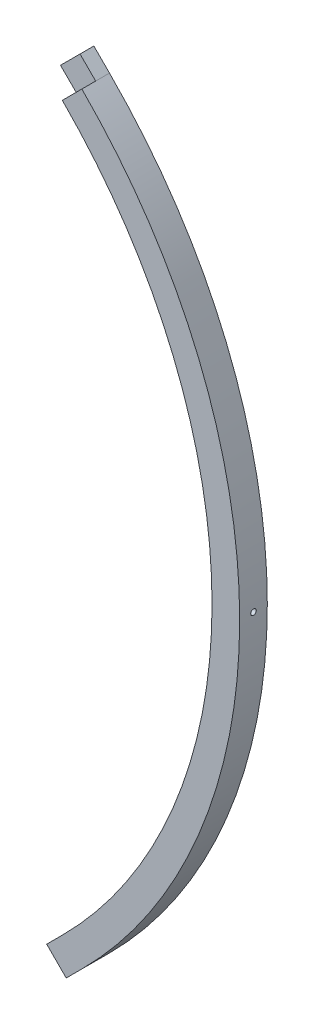
ISO-10303-21;
HEADER;
FILE_DESCRIPTION(('STEP AP214'),'2;1');
FILE_NAME('part.step','',(''),(''),'','','');
FILE_SCHEMA(('AUTOMOTIVE_DESIGN { 1 0 10303 214 1 1 1 1 }'));
ENDSEC;
DATA;
#1=APPLICATION_CONTEXT('core data for automotive mechanical design processes');
#2=APPLICATION_PROTOCOL_DEFINITION('international standard','automotive_design',2000,#1);
#3=PRODUCT_CONTEXT('',#1,'mechanical');
#4=PRODUCT('Part','Part','',(#3));
#5=PRODUCT_RELATED_PRODUCT_CATEGORY('part','',(#4));
#6=PRODUCT_DEFINITION_FORMATION('','',#4);
#7=PRODUCT_DEFINITION_CONTEXT('part definition',#1,'design');
#8=PRODUCT_DEFINITION('design','',#6,#7);
#9=PRODUCT_DEFINITION_SHAPE('','',#8);
#10=(LENGTH_UNIT() NAMED_UNIT(*) SI_UNIT(.MILLI.,.METRE.));
#11=(NAMED_UNIT(*) PLANE_ANGLE_UNIT() SI_UNIT($,.RADIAN.));
#12=(NAMED_UNIT(*) SI_UNIT($,.STERADIAN.) SOLID_ANGLE_UNIT());
#13=UNCERTAINTY_MEASURE_WITH_UNIT(LENGTH_MEASURE(1.E-05),#10,'distance_accuracy_value','');
#14=(GEOMETRIC_REPRESENTATION_CONTEXT(3) GLOBAL_UNCERTAINTY_ASSIGNED_CONTEXT((#13)) GLOBAL_UNIT_ASSIGNED_CONTEXT((#10,
#11,#12)) REPRESENTATION_CONTEXT('',''));
#15=CARTESIAN_POINT('',(0.,0.,0.));
#16=DIRECTION('',(0.,0.,1.));
#17=DIRECTION('',(1.,0.,0.));
#18=AXIS2_PLACEMENT_3D('',#15,#16,#17);
#19=CARTESIAN_POINT('',(0.,0.,139.));
#20=DIRECTION('',(-0.707106781186548,0.707106781186548,0.));
#21=DIRECTION('',(-0.707106781186548,-0.707106781186548,0.));
#22=AXIS2_PLACEMENT_3D('',#19,#20,#21);
#23=PLANE('',#22);
#24=DIRECTION('',(0.,0.,-1.));
#25=VECTOR('',#24,1.);
#26=CARTESIAN_POINT('',(137.885822331377,137.885822331377,139.));
#27=LINE('',#26,#25);
#28=CARTESIAN_POINT('',(137.885822331377,137.885822331377,10.));
#29=VERTEX_POINT('',#28);
#30=CARTESIAN_POINT('',(137.885822331377,137.885822331377,5.));
#31=VERTEX_POINT('',#30);
#32=EDGE_CURVE('E210',#29,#31,#27,.T.);
#33=ORIENTED_EDGE('',*,*,#32,.T.);
#34=DIRECTION('',(-0.707106781186548,-0.707106781186548,0.));
#35=VECTOR('',#34,1.);
#36=CARTESIAN_POINT('',(0.,0.,5.));
#37=LINE('',#36,#35);
#38=CARTESIAN_POINT('',(130.814754519511,130.814754519511,5.));
#39=VERTEX_POINT('',#38);
#40=EDGE_CURVE('E135',#31,#39,#37,.T.);
#41=ORIENTED_EDGE('',*,*,#40,.T.);
#42=DIRECTION('',(0.,0.,-1.));
#43=VECTOR('',#42,1.);
#44=CARTESIAN_POINT('',(130.814754519511,130.814754519511,139.));
#45=LINE('',#44,#43);
#46=CARTESIAN_POINT('',(130.814754519511,130.814754519511,10.));
#47=VERTEX_POINT('',#46);
#48=EDGE_CURVE('E221',#47,#39,#45,.T.);
#49=ORIENTED_EDGE('',*,*,#48,.F.);
#50=DIRECTION('',(-0.707106781186548,-0.707106781186548,0.));
#51=VECTOR('',#50,1.);
#52=CARTESIAN_POINT('',(0.,0.,10.));
#53=LINE('',#52,#51);
#54=EDGE_CURVE('E214',#29,#47,#53,.T.);
#55=ORIENTED_EDGE('',*,*,#54,.F.);
#56=EDGE_LOOP('',(#33,#41,#49,#55));
#57=FACE_BOUND('',#56,.T.);
#58=ADVANCED_FACE('F41',(#57),#23,.T.);
#59=CARTESIAN_POINT('',(0.,0.,139.));
#60=DIRECTION('',(0.707106781186548,0.707106781186548,0.));
#61=DIRECTION('',(-0.707106781186548,0.707106781186548,0.));
#62=AXIS2_PLACEMENT_3D('',#59,#60,#61);
#63=PLANE('',#62);
#64=DIRECTION('',(0.707106781186548,-0.707106781186548,0.));
#65=VECTOR('',#64,1.);
#66=CARTESIAN_POINT('',(0.,0.,5.));
#67=LINE('',#66,#65);
#68=CARTESIAN_POINT('',(130.814754519511,-130.814754519511,5.));
#69=VERTEX_POINT('',#68);
#70=CARTESIAN_POINT('',(137.885822331377,-137.885822331377,5.));
#71=VERTEX_POINT('',#70);
#72=EDGE_CURVE('E73',#69,#71,#67,.T.);
#73=ORIENTED_EDGE('',*,*,#72,.F.);
#74=DIRECTION('',(0.,0.,-1.));
#75=VECTOR('',#74,1.);
#76=CARTESIAN_POINT('',(130.814754519511,-130.814754519511,139.));
#77=LINE('',#76,#75);
#78=CARTESIAN_POINT('',(130.814754519511,-130.814754519511,0.));
#79=VERTEX_POINT('',#78);
#80=EDGE_CURVE('E220',#69,#79,#77,.T.);
#81=ORIENTED_EDGE('',*,*,#80,.T.);
#82=DIRECTION('',(0.707106781186548,-0.707106781186548,0.));
#83=VECTOR('',#82,1.);
#84=CARTESIAN_POINT('',(0.,0.,0.));
#85=LINE('',#84,#83);
#86=CARTESIAN_POINT('',(137.885822331377,-137.885822331377,0.));
#87=VERTEX_POINT('',#86);
#88=EDGE_CURVE('E206',#79,#87,#85,.T.);
#89=ORIENTED_EDGE('',*,*,#88,.T.);
#90=DIRECTION('',(0.,0.,-1.));
#91=VECTOR('',#90,1.);
#92=CARTESIAN_POINT('',(137.885822331377,-137.885822331377,139.));
#93=LINE('',#92,#91);
#94=EDGE_CURVE('E215',#71,#87,#93,.T.);
#95=ORIENTED_EDGE('',*,*,#94,.F.);
#96=EDGE_LOOP('',(#73,#81,#89,#95));
#97=FACE_BOUND('',#96,.T.);
#98=ADVANCED_FACE('F264',(#97),#63,.F.);
#99=CARTESIAN_POINT('',(0.,0.,10.));
#100=DIRECTION('',(0.,0.,-1.));
#101=DIRECTION('',(-1.,0.,0.));
#102=AXIS2_PLACEMENT_3D('',#99,#100,#101);
#103=CYLINDRICAL_SURFACE('',#102,195.);
#104=CARTESIAN_POINT('',(0.,0.,10.));
#105=DIRECTION('',(0.,0.,1.));
#106=DIRECTION('',(1.,0.,0.));
#107=AXIS2_PLACEMENT_3D('',#104,#105,#106);
#108=CIRCLE('',#107,195.);
#109=CARTESIAN_POINT('',(137.885822331377,-137.885822331377,10.));
#110=VERTEX_POINT('',#109);
#111=EDGE_CURVE('E11',#110,#29,#108,.T.);
#112=ORIENTED_EDGE('',*,*,#111,.F.);
#113=EDGE_CURVE('E211',#110,#71,#93,.T.);
#114=ORIENTED_EDGE('',*,*,#113,.T.);
#115=ORIENTED_EDGE('',*,*,#94,.T.);
#116=CARTESIAN_POINT('',(0.,0.,0.));
#117=DIRECTION('',(0.,0.,1.));
#118=DIRECTION('',(1.,0.,0.));
#119=AXIS2_PLACEMENT_3D('',#116,#117,#118);
#120=CIRCLE('',#119,195.);
#121=CARTESIAN_POINT('',(137.885822331377,137.885822331377,0.));
#122=VERTEX_POINT('',#121);
#123=EDGE_CURVE('E57',#87,#122,#120,.T.);
#124=ORIENTED_EDGE('',*,*,#123,.T.);
#125=DIRECTION('',(0.,0.,-1.));
#126=VECTOR('',#125,1.);
#127=CARTESIAN_POINT('',(137.885822331377,137.885822331377,0.));
#128=LINE('',#127,#126);
#129=EDGE_CURVE('E156',#31,#122,#128,.T.);
#130=ORIENTED_EDGE('',*,*,#129,.F.);
#131=ORIENTED_EDGE('',*,*,#32,.F.);
#132=EDGE_LOOP('',(#112,#114,#115,#124,#130,#131));
#133=FACE_BOUND('',#132,.T.);
#134=CARTESIAN_POINT('',(195.,0.,6.));
#135=CARTESIAN_POINT('',(194.999999965327,-0.0561700427574793,5.99999750928889));
#136=CARTESIAN_POINT('',(194.999975469612,-0.112380804679505,5.99525150927542));
#137=CARTESIAN_POINT('',(194.999880106191,-0.223254227617488,5.97638464830237));
#138=CARTESIAN_POINT('',(194.999809182684,-0.277914943033491,5.9622525057641));
#139=CARTESIAN_POINT('',(194.999628998058,-0.38406595254384,5.92501570410519));
#140=CARTESIAN_POINT('',(194.999519755267,-0.43555774842897,5.90191533367156));
#141=CARTESIAN_POINT('',(194.99927526481,-0.533917824580093,5.84740370906358));
#142=CARTESIAN_POINT('',(194.999140023609,-0.580787249943005,5.8159945203631));
#143=CARTESIAN_POINT('',(194.998858748926,-0.668593964518465,5.74575020299985));
#144=CARTESIAN_POINT('',(194.998712714227,-0.709530583657943,5.70691423667652));
#145=CARTESIAN_POINT('',(194.998426323083,-0.784304319411508,5.6229193177131));
#146=CARTESIAN_POINT('',(194.998285966862,-0.818141157104063,5.57776011677499));
#147=CARTESIAN_POINT('',(194.998026765331,-0.877752499155994,5.48240246823632));
#148=CARTESIAN_POINT('',(194.99790791974,-0.903527109287217,5.43220408675835));
#149=CARTESIAN_POINT('',(194.997705136625,-0.946282825200783,5.32819265591582));
#150=CARTESIAN_POINT('',(194.997621199029,-0.963263949178651,5.27437961403098));
#151=CARTESIAN_POINT('',(194.997497695716,-0.987950614499664,5.1646667690424));
#152=CARTESIAN_POINT('',(194.997458129688,-0.995656220884792,5.10876698057421));
#153=CARTESIAN_POINT('',(194.997427829408,-1.00157329952117,4.99646724778798));
#154=CARTESIAN_POINT('',(194.997437095065,-0.999784789487698,4.94006730440338));
#155=CARTESIAN_POINT('',(194.997503412978,-0.986764512178178,4.82836872592286));
#156=CARTESIAN_POINT('',(194.997560464802,-0.975532830252614,4.77307008087767));
#157=CARTESIAN_POINT('',(194.997715922301,-0.943945159213853,4.66514326214855));
#158=CARTESIAN_POINT('',(194.997814328021,-0.923589160162509,4.61251509137336));
#159=CARTESIAN_POINT('',(194.998041399341,-0.87433060514092,4.51142297158604));
#160=CARTESIAN_POINT('',(194.998170065076,-0.845428011055289,4.46295904114649));
#161=CARTESIAN_POINT('',(194.998443150182,-0.77989676630526,4.37157136761662));
#162=CARTESIAN_POINT('',(194.998587569548,-0.74326811816065,4.32864762271941));
#163=CARTESIAN_POINT('',(194.998875881859,-0.66332402880329,4.24955825290822));
#164=CARTESIAN_POINT('',(194.999019774797,-0.620008509698191,4.21339270672829));
#165=CARTESIAN_POINT('',(194.999290809853,-0.527920547393154,4.14884696896129));
#166=CARTESIAN_POINT('',(194.99941795197,-0.479148103475928,4.12046677839759));
#167=CARTESIAN_POINT('',(194.999641151155,-0.3775307614997,4.07229739794683));
#168=CARTESIAN_POINT('',(194.999737208217,-0.324685862518095,4.05250821000606));
#169=CARTESIAN_POINT('',(194.999887407497,-0.216423740359311,4.02208263927458));
#170=CARTESIAN_POINT('',(194.999941549721,-0.16100651749917,4.01144625535579));
#171=CARTESIAN_POINT('',(195.000001814811,-0.0491735529694545,3.99962832171398));
#172=CARTESIAN_POINT('',(195.000007938224,0.00724217731589919,3.99844666426487));
#173=CARTESIAN_POINT('',(194.999971476776,0.119471277683585,4.00557144695906));
#174=CARTESIAN_POINT('',(194.999928891913,0.175284647759942,4.01387788719649));
#175=CARTESIAN_POINT('',(194.999799815327,0.284724351598063,4.03974298208161));
#176=CARTESIAN_POINT('',(194.999713323834,0.338350696794177,4.05730158834984));
#177=CARTESIAN_POINT('',(194.999506185112,0.441894401754199,4.10117252636068));
#178=CARTESIAN_POINT('',(194.999385537886,0.491811761769895,4.12748485750903));
#179=CARTESIAN_POINT('',(194.999123688085,0.586520988262377,4.18811659101685));
#180=CARTESIAN_POINT('',(194.998982485327,0.631312808902113,4.22243606497484));
#181=CARTESIAN_POINT('',(194.998695444373,0.714499007167161,4.29810776611433));
#182=CARTESIAN_POINT('',(194.998549606175,0.752893381802226,4.33945999658302));
#183=CARTESIAN_POINT('',(194.998269734921,0.822195132823353,4.42802380835305));
#184=CARTESIAN_POINT('',(194.998135701978,0.85310243745302,4.47523544580463));
#185=CARTESIAN_POINT('',(194.997894554343,0.906552163269164,4.57417753232033));
#186=CARTESIAN_POINT('',(194.997787439622,0.929094593579837,4.62590797645536));
#187=CARTESIAN_POINT('',(194.997612205448,0.965174574853683,4.73241896230374));
#188=CARTESIAN_POINT('',(194.997544085786,0.97871217433128,4.78719948758275));
#189=CARTESIAN_POINT('',(194.997454521003,0.996398378516396,4.89825591457816));
#190=CARTESIAN_POINT('',(194.997433075963,1.0005469670395,4.95453181887206));
#191=CARTESIAN_POINT('',(194.997439278513,0.999337333540501,5.06698060298473));
#192=CARTESIAN_POINT('',(194.997466925448,0.993979238581673,5.12315348417042));
#193=CARTESIAN_POINT('',(194.997568193698,0.973908568331291,5.23380250667898));
#194=CARTESIAN_POINT('',(194.997641815105,0.959195974235457,5.28827864459086));
#195=CARTESIAN_POINT('',(194.99782673377,0.920833638030294,5.39398864687603));
#196=CARTESIAN_POINT('',(194.997938031729,0.897183729665312,5.44522245091337));
#197=CARTESIAN_POINT('',(194.998185749824,0.841619125480419,5.54299039607154));
#198=CARTESIAN_POINT('',(194.998322168976,0.809704753430099,5.58952472120047));
#199=CARTESIAN_POINT('',(194.998604739991,0.738520541059488,5.67657102458573));
#200=CARTESIAN_POINT('',(194.998750890947,0.699251386211935,5.71708356344764));
#201=CARTESIAN_POINT('',(194.999036498686,0.614457557526826,5.79095118783567));
#202=CARTESIAN_POINT('',(194.999175953796,0.568931331481623,5.82430449207619));
#203=CARTESIAN_POINT('',(194.99943246922,0.472907480285743,5.88290723832369));
#204=CARTESIAN_POINT('',(194.999549518697,0.422407467208872,5.90815276274138));
#205=CARTESIAN_POINT('',(194.999747797733,0.317925375579559,5.94977815488281));
#206=CARTESIAN_POINT('',(194.999829070206,0.263947558144781,5.96616864927851));
#207=CARTESIAN_POINT('',(194.999924794305,0.174688187979034,5.98525101010267));
#208=CARTESIAN_POINT('',(194.999952874926,0.139986605025111,5.99077497702719));
#209=CARTESIAN_POINT('',(194.999990488608,0.0701953164853874,5.99815025029287));
#210=CARTESIAN_POINT('',(195.00000002167,0.0351056109028527,6.00000155666492));
#211=CARTESIAN_POINT('',(195.,0.,6.));
#212=B_SPLINE_CURVE_WITH_KNOTS('',3,(#134,#135,#136,#137,#138,#139,#140,#141,#142,#143,#144,
#145,#146,#147,#148,#149,#150,#151,#152,#153,#154,#155,#156,#157,#158,#159,#160,#161,#162,#163,
#164,#165,#166,#167,#168,#169,#170,#171,#172,#173,#174,#175,#176,#177,#178,#179,#180,#181,#182,
#183,#184,#185,#186,#187,#188,#189,#190,#191,#192,#193,#194,#195,#196,#197,#198,#199,#200,#201,
#202,#203,#204,#205,#206,#207,#208,#209,#210,#211),.UNSPECIFIED.,.T.,.F.,(4,2,2,2,2,2,2,2,2,2,2,
2,2,2,2,2,2,2,2,2,2,2,2,2,2,2,2,2,2,2,2,2,2,2,2,2,2,2,4),(0.,0.168381992750483,
0.336966737668812,0.50547096295735,0.673933339389159,0.842414727781486,1.01090273388347,
1.1793885294258,1.34787397633513,1.51635824178032,1.68484219284708,1.85332462111697,
2.0218072328973,2.19029059607355,2.35877390430046,2.52725917526168,2.69574446836956,
2.86422979964747,3.03271511015966,3.2011985009664,3.36968189344445,3.53816440493341,
3.70664690498479,3.87513091163614,4.04361499703882,4.21210069713623,4.38058621345311,
4.54907082203011,4.71755572103408,4.88603836813989,5.05452135392815,5.22300747406155,
5.39148699456141,5.55995082041694,5.72845651321086,5.89704350401415,6.0654277263599,
6.17066447677132,6.27590122629753),.UNSPECIFIED.);
#213=CARTESIAN_POINT('',(195.,0.,6.));
#214=VERTEX_POINT('',#213);
#215=EDGE_CURVE('E231',#214,#214,#212,.T.);
#216=ORIENTED_EDGE('',*,*,#215,.F.);
#217=EDGE_LOOP('',(#216));
#218=FACE_BOUND('',#217,.T.);
#219=ADVANCED_FACE('F43',(#133,#218),#103,.T.);
#220=CARTESIAN_POINT('',(0.,0.,10.));
#221=DIRECTION('',(0.,0.,-1.));
#222=DIRECTION('',(-1.,0.,0.));
#223=AXIS2_PLACEMENT_3D('',#220,#221,#222);
#224=CYLINDRICAL_SURFACE('',#223,185.);
#225=CARTESIAN_POINT('',(130.814754519511,-130.814754519511,10.));
#226=VERTEX_POINT('',#225);
#227=EDGE_CURVE('E216',#226,#69,#77,.T.);
#228=ORIENTED_EDGE('',*,*,#227,.F.);
#229=CARTESIAN_POINT('',(0.,0.,10.));
#230=DIRECTION('',(0.,0.,1.));
#231=DIRECTION('',(1.,0.,0.));
#232=AXIS2_PLACEMENT_3D('',#229,#230,#231);
#233=CIRCLE('',#232,185.);
#234=EDGE_CURVE('E239',#226,#47,#233,.T.);
#235=ORIENTED_EDGE('',*,*,#234,.T.);
#236=ORIENTED_EDGE('',*,*,#48,.T.);
#237=DIRECTION('',(0.,0.,1.));
#238=VECTOR('',#237,1.);
#239=CARTESIAN_POINT('',(130.814754519511,130.814754519511,0.));
#240=LINE('',#239,#238);
#241=CARTESIAN_POINT('',(130.814754519511,130.814754519511,0.));
#242=VERTEX_POINT('',#241);
#243=EDGE_CURVE('E65',#242,#39,#240,.T.);
#244=ORIENTED_EDGE('',*,*,#243,.F.);
#245=CARTESIAN_POINT('',(0.,0.,0.));
#246=DIRECTION('',(0.,0.,1.));
#247=DIRECTION('',(1.,0.,0.));
#248=AXIS2_PLACEMENT_3D('',#245,#246,#247);
#249=CIRCLE('',#248,185.);
#250=EDGE_CURVE('E238',#79,#242,#249,.T.);
#251=ORIENTED_EDGE('',*,*,#250,.F.);
#252=ORIENTED_EDGE('',*,*,#80,.F.);
#253=EDGE_LOOP('',(#228,#235,#236,#244,#251,#252));
#254=FACE_BOUND('',#253,.T.);
#255=CARTESIAN_POINT('',(185.,0.,6.));
#256=CARTESIAN_POINT('',(184.999999963453,-0.056169998764352,5.99999750930369));
#257=CARTESIAN_POINT('',(184.999974143686,-0.11238071561792,5.99525151669553));
#258=CARTESIAN_POINT('',(184.999873625645,-0.223254046643,5.97638468685081));
#259=CARTESIAN_POINT('',(184.999798868555,-0.27791471526249,5.96225256833333));
#260=CARTESIAN_POINT('',(184.999608944514,-0.384065630941757,5.9250158342348));
#261=CARTESIAN_POINT('',(184.999493796884,-0.43555737990926,5.90191550766809));
#262=CARTESIAN_POINT('',(184.999236091078,-0.533917371535847,5.84740399037893));
#263=CARTESIAN_POINT('',(184.999093539716,-0.580786759221734,5.81599486500276));
#264=CARTESIAN_POINT('',(184.998797061135,-0.668593455494542,5.74575065814661));
#265=CARTESIAN_POINT('',(184.998643132623,-0.70953008859501,5.70691473223819));
#266=CARTESIAN_POINT('',(184.99834126067,-0.784303862364997,5.62291989167873));
#267=CARTESIAN_POINT('',(184.998193317465,-0.818140724100741,5.57776072871835));
#268=CARTESIAN_POINT('',(184.997920104531,-0.877752143298278,5.48240311819685));
#269=CARTESIAN_POINT('',(184.997794834518,-0.903526801603803,5.43220473367775));
#270=CARTESIAN_POINT('',(184.997581089484,-0.946282610189101,5.32819328055058));
#271=CARTESIAN_POINT('',(184.997492614386,-0.963263778721366,5.27438021944571));
#272=CARTESIAN_POINT('',(184.997362434697,-0.987950511956365,5.16466737689804));
#273=CARTESIAN_POINT('',(184.997320729731,-0.99565615088585,5.10876761215763));
#274=CARTESIAN_POINT('',(184.997288791168,-1.00157330083936,4.99646791968125));
#275=CARTESIAN_POINT('',(184.997298557474,-0.999784829646088,4.94006799288229));
#276=CARTESIAN_POINT('',(184.99736845976,-0.98676464274239,4.8283695020497));
#277=CARTESIAN_POINT('',(184.997428595231,-0.975533022250442,4.77307092691653));
#278=CARTESIAN_POINT('',(184.997592455331,-0.943945500344341,4.66514423767283));
#279=CARTESIAN_POINT('',(184.997696180006,-0.923589588958082,4.61251612648097));
#280=CARTESIAN_POINT('',(184.997935524963,-0.874331221624814,4.5114240816823));
#281=CARTESIAN_POINT('',(184.998071145403,-0.845428723022011,4.46296016886045));
#282=CARTESIAN_POINT('',(184.998358991537,-0.779897682158746,4.37157251000944));
#283=CARTESIAN_POINT('',(184.998511217225,-0.743269142350609,4.32864876222178));
#284=CARTESIAN_POINT('',(184.998815114046,-0.663325223648003,4.24955930871775));
#285=CARTESIAN_POINT('',(184.998966785172,-0.620009758314378,4.21339369037431));
#286=CARTESIAN_POINT('',(184.999252471274,-0.527921886126884,4.14884779882796));
#287=CARTESIAN_POINT('',(184.999386486248,-0.479149478555264,4.12046752664906));
#288=CARTESIAN_POINT('',(184.999621750971,-0.37753218600141,4.07229797677546));
#289=CARTESIAN_POINT('',(184.999723000713,-0.324687299974519,4.05250870128451));
#290=CARTESIAN_POINT('',(184.999881319727,-0.216425182084915,4.02208295715273));
#291=CARTESIAN_POINT('',(184.999938389003,-0.161007950561575,4.01144648730437));
#292=CARTESIAN_POINT('',(185.000001912502,-0.04917502232657,3.99962839648125));
#293=CARTESIAN_POINT('',(185.000008367365,0.00724066173670763,3.99844665581987));
#294=CARTESIAN_POINT('',(184.999969935997,0.119469683422408,4.00557125798055));
#295=CARTESIAN_POINT('',(184.999925049766,0.175283021041205,4.01387760085972));
#296=CARTESIAN_POINT('',(184.999788997138,0.28472264152107,4.03974247980008));
#297=CARTESIAN_POINT('',(184.999697831011,0.338348937096478,4.05730096206582));
#298=CARTESIAN_POINT('',(184.999479496722,0.441892565162782,4.10117162891953));
#299=CARTESIAN_POINT('',(184.999352328562,0.491809897879607,4.12748381297429));
#300=CARTESIAN_POINT('',(184.999076325492,0.586519148135399,4.1881152642877));
#301=CARTESIAN_POINT('',(184.998927490366,0.631311014670736,4.22243461121548));
#302=CARTESIAN_POINT('',(184.998624933839,0.71449732997275,4.29810606204115));
#303=CARTESIAN_POINT('',(184.998471212435,0.7528917757047,4.33945816927512));
#304=CARTESIAN_POINT('',(184.998176212434,0.822193732053476,4.42802179305794));
#305=CARTESIAN_POINT('',(184.998034933968,0.853101163217055,4.47523337178028));
#306=CARTESIAN_POINT('',(184.997780750132,0.906551149209531,4.57417537043761));
#307=CARTESIAN_POINT('',(184.997667844731,0.929093713195242,4.62590578542588));
#308=CARTESIAN_POINT('',(184.997483137028,0.965173951500727,4.73241671419921));
#309=CARTESIAN_POINT('',(184.997411334481,0.978711679347289,4.78719720985182));
#310=CARTESIAN_POINT('',(184.997316926876,0.996398142723863,4.89825360360009));
#311=CARTESIAN_POINT('',(184.997294321902,1.000546862151,4.95452950426033));
#312=CARTESIAN_POINT('',(184.997300858329,0.999337488837895,5.06697823086784));
#313=CARTESIAN_POINT('',(184.997329998972,0.993979535256863,5.12315105831186));
#314=CARTESIAN_POINT('',(184.997436739774,0.973909167054334,5.23379999619835));
#315=CARTESIAN_POINT('',(184.99751434003,0.959196733629315,5.28827610323001));
#316=CARTESIAN_POINT('',(184.997709253022,0.920834736157888,5.3939860697002));
#317=CARTESIAN_POINT('',(184.997826566496,0.897185005879216,5.44521986881164));
#318=CARTESIAN_POINT('',(184.99808767375,0.841620771098656,5.5429878370667));
#319=CARTESIAN_POINT('',(184.998231466491,0.809706590282481,5.58952219016976));
#320=CARTESIAN_POINT('',(184.998529311227,0.7385227199247,5.67656864504324));
#321=CARTESIAN_POINT('',(184.998683362277,0.699253706479979,5.71708129974799));
#322=CARTESIAN_POINT('',(184.998984408656,0.614460139381037,5.79094918108799));
#323=CARTESIAN_POINT('',(184.999131402222,0.568934033533058,5.82430262646598));
#324=CARTESIAN_POINT('',(184.999401784391,0.472910366219206,5.88290569381243));
#325=CARTESIAN_POINT('',(184.999525161558,0.422410414089445,5.90815139373502));
#326=CARTESIAN_POINT('',(184.999734159945,0.317928404912174,5.94977714252628));
#327=CARTESIAN_POINT('',(184.999819826397,0.263950608955148,5.96616781787776));
#328=CARTESIAN_POINT('',(184.999920726796,0.174690756440777,5.98525057321122));
#329=CARTESIAN_POINT('',(184.999950326157,0.139988670838887,5.99077470358214));
#330=CARTESIAN_POINT('',(184.99998997418,0.070196358621374,5.99815019529936));
#331=CARTESIAN_POINT('',(185.000000022842,0.0351061320093793,6.00000155667999));
#332=CARTESIAN_POINT('',(185.,0.,6.));
#333=B_SPLINE_CURVE_WITH_KNOTS('',3,(#255,#256,#257,#258,#259,#260,#261,#262,#263,#264,#265,
#266,#267,#268,#269,#270,#271,#272,#273,#274,#275,#276,#277,#278,#279,#280,#281,#282,#283,#284,
#285,#286,#287,#288,#289,#290,#291,#292,#293,#294,#295,#296,#297,#298,#299,#300,#301,#302,#303,
#304,#305,#306,#307,#308,#309,#310,#311,#312,#313,#314,#315,#316,#317,#318,#319,#320,#321,#322,
#323,#324,#325,#326,#327,#328,#329,#330,#331,#332),.UNSPECIFIED.,.T.,.F.,(4,2,2,2,2,2,2,2,2,2,2,
2,2,2,2,2,2,2,2,2,2,2,2,2,2,2,2,2,2,2,2,2,2,2,2,2,2,2,4),(0.,0.168381858854091,
0.336966464713395,0.505470544693635,0.673932778338218,0.842414177566964,1.01090219480558,
1.17938810447643,1.34787366442261,1.51635787606639,1.68484177213534,1.85332396934446,
2.02180635069133,2.19028957294356,2.35877274171754,2.52725808858703,2.69574345761747,
2.86422886986733,3.03271425988863,3.201197517064,3.36968077525344,3.53816305382806,
3.70664532213973,3.87512926687651,4.04361329153635,4.21209910409392,4.38058473221368,
4.54906935880771,4.71755427436564,4.88603672365226,5.05451951160803,5.22300543347044,
5.39148475740607,5.55994860138531,5.72845431178956,5.89704141289923,6.06542574890547,
6.17066406028525,6.27590237068144),.UNSPECIFIED.);
#334=CARTESIAN_POINT('',(185.,0.,6.));
#335=VERTEX_POINT('',#334);
#336=EDGE_CURVE('E46',#335,#335,#333,.T.);
#337=ORIENTED_EDGE('',*,*,#336,.T.);
#338=EDGE_LOOP('',(#337));
#339=FACE_BOUND('',#338,.T.);
#340=ADVANCED_FACE('F249',(#254,#339),#224,.F.);
#341=CARTESIAN_POINT('',(0.,0.,10.));
#342=DIRECTION('',(0.,0.,1.));
#343=DIRECTION('',(1.,0.,0.));
#344=AXIS2_PLACEMENT_3D('',#341,#342,#343);
#345=PLANE('',#344);
#346=ORIENTED_EDGE('',*,*,#234,.F.);
#347=DIRECTION('',(0.707106781186548,0.707106781186547,0.));
#348=VECTOR('',#347,1.);
#349=CARTESIAN_POINT('',(125.157900270019,-136.471608769004,10.));
#350=LINE('',#349,#348);
#351=CARTESIAN_POINT('',(125.157900270019,-136.471608769004,10.));
#352=VERTEX_POINT('',#351);
#353=EDGE_CURVE('E188',#352,#226,#350,.T.);
#354=ORIENTED_EDGE('',*,*,#353,.F.);
#355=DIRECTION('',(-0.707106781186548,0.707106781186548,0.));
#356=VECTOR('',#355,1.);
#357=CARTESIAN_POINT('',(-5.65685424949239,-5.65685424949239,10.));
#358=LINE('',#357,#356);
#359=CARTESIAN_POINT('',(132.228968081884,-143.542676580869,10.));
#360=VERTEX_POINT('',#359);
#361=EDGE_CURVE('E185',#360,#352,#358,.T.);
#362=ORIENTED_EDGE('',*,*,#361,.F.);
#363=DIRECTION('',(0.707106781186548,0.707106781186547,0.));
#364=VECTOR('',#363,1.);
#365=CARTESIAN_POINT('',(132.228968081884,-143.542676580869,10.));
#366=LINE('',#365,#364);
#367=EDGE_CURVE('E194',#360,#110,#366,.T.);
#368=ORIENTED_EDGE('',*,*,#367,.T.);
#369=ORIENTED_EDGE('',*,*,#111,.T.);
#370=ORIENTED_EDGE('',*,*,#54,.T.);
#371=EDGE_LOOP('',(#346,#354,#362,#368,#369,#370));
#372=FACE_BOUND('',#371,.T.);
#373=ADVANCED_FACE('F254',(#372),#345,.T.);
#374=CARTESIAN_POINT('',(0.,0.,0.));
#375=DIRECTION('',(0.,0.,1.));
#376=DIRECTION('',(1.,0.,0.));
#377=AXIS2_PLACEMENT_3D('',#374,#375,#376);
#378=PLANE('',#377);
#379=ORIENTED_EDGE('',*,*,#123,.F.);
#380=ORIENTED_EDGE('',*,*,#88,.F.);
#381=ORIENTED_EDGE('',*,*,#250,.T.);
#382=DIRECTION('',(0.707106781186548,-0.707106781186547,0.));
#383=VECTOR('',#382,1.);
#384=CARTESIAN_POINT('',(125.157900270019,136.471608769004,0.));
#385=LINE('',#384,#383);
#386=CARTESIAN_POINT('',(125.157900270019,136.471608769004,0.));
#387=VERTEX_POINT('',#386);
#388=EDGE_CURVE('E170',#387,#242,#385,.T.);
#389=ORIENTED_EDGE('',*,*,#388,.F.);
#390=DIRECTION('',(-0.707106781186548,-0.707106781186548,0.));
#391=VECTOR('',#390,1.);
#392=CARTESIAN_POINT('',(-5.65685424949239,5.65685424949239,0.));
#393=LINE('',#392,#391);
#394=CARTESIAN_POINT('',(132.228968081884,143.542676580869,0.));
#395=VERTEX_POINT('',#394);
#396=EDGE_CURVE('E148',#395,#387,#393,.T.);
#397=ORIENTED_EDGE('',*,*,#396,.F.);
#398=DIRECTION('',(0.707106781186548,-0.707106781186547,0.));
#399=VECTOR('',#398,1.);
#400=CARTESIAN_POINT('',(132.228968081884,143.542676580869,0.));
#401=LINE('',#400,#399);
#402=EDGE_CURVE('E139',#395,#122,#401,.T.);
#403=ORIENTED_EDGE('',*,*,#402,.T.);
#404=EDGE_LOOP('',(#379,#380,#381,#389,#397,#403));
#405=FACE_BOUND('',#404,.T.);
#406=ADVANCED_FACE('F246',(#405),#378,.F.);
#407=CARTESIAN_POINT('',(250.,0.,5.));
#408=DIRECTION('',(-1.,0.,0.));
#409=DIRECTION('',(0.,0.,1.));
#410=AXIS2_PLACEMENT_3D('',#407,#408,#409);
#411=CYLINDRICAL_SURFACE('',#410,1.);
#412=ORIENTED_EDGE('',*,*,#336,.F.);
#413=EDGE_LOOP('',(#412));
#414=FACE_BOUND('',#413,.T.);
#415=ORIENTED_EDGE('',*,*,#215,.T.);
#416=EDGE_LOOP('',(#415));
#417=FACE_BOUND('',#416,.T.);
#418=ADVANCED_FACE('F241',(#414,#417),#411,.F.);
#419=CARTESIAN_POINT('',(125.157900270019,-136.471608769004,0.));
#420=DIRECTION('',(0.707106781186547,-0.707106781186548,0.));
#421=DIRECTION('',(0.707106781186548,0.707106781186547,0.));
#422=AXIS2_PLACEMENT_3D('',#419,#420,#421);
#423=PLANE('',#422);
#424=ORIENTED_EDGE('',*,*,#227,.T.);
#425=DIRECTION('',(0.707106781186548,0.707106781186547,0.));
#426=VECTOR('',#425,1.);
#427=CARTESIAN_POINT('',(125.157900270019,-136.471608769004,5.));
#428=LINE('',#427,#426);
#429=CARTESIAN_POINT('',(125.157900270019,-136.471608769004,5.));
#430=VERTEX_POINT('',#429);
#431=EDGE_CURVE('E202',#430,#69,#428,.T.);
#432=ORIENTED_EDGE('',*,*,#431,.F.);
#433=DIRECTION('',(0.,0.,-1.));
#434=VECTOR('',#433,1.);
#435=CARTESIAN_POINT('',(125.157900270019,-136.471608769004,0.));
#436=LINE('',#435,#434);
#437=EDGE_CURVE('E175',#352,#430,#436,.T.);
#438=ORIENTED_EDGE('',*,*,#437,.F.);
#439=ORIENTED_EDGE('',*,*,#353,.T.);
#440=EDGE_LOOP('',(#424,#432,#438,#439));
#441=FACE_BOUND('',#440,.T.);
#442=ADVANCED_FACE('F245',(#441),#423,.F.);
#443=CARTESIAN_POINT('',(-5.65685424949239,-5.65685424949239,5.));
#444=DIRECTION('',(0.,0.,1.));
#445=DIRECTION('',(1.,0.,0.));
#446=AXIS2_PLACEMENT_3D('',#443,#444,#445);
#447=PLANE('',#446);
#448=ORIENTED_EDGE('',*,*,#72,.T.);
#449=DIRECTION('',(0.707106781186548,0.707106781186547,0.));
#450=VECTOR('',#449,1.);
#451=CARTESIAN_POINT('',(132.228968081884,-143.542676580869,5.));
#452=LINE('',#451,#450);
#453=CARTESIAN_POINT('',(132.228968081884,-143.542676580869,5.));
#454=VERTEX_POINT('',#453);
#455=EDGE_CURVE('E198',#454,#71,#452,.T.);
#456=ORIENTED_EDGE('',*,*,#455,.F.);
#457=DIRECTION('',(0.707106781186548,-0.707106781186548,0.));
#458=VECTOR('',#457,1.);
#459=CARTESIAN_POINT('',(-5.65685424949239,-5.65685424949239,5.));
#460=LINE('',#459,#458);
#461=EDGE_CURVE('E179',#430,#454,#460,.T.);
#462=ORIENTED_EDGE('',*,*,#461,.F.);
#463=ORIENTED_EDGE('',*,*,#431,.T.);
#464=EDGE_LOOP('',(#448,#456,#462,#463));
#465=FACE_BOUND('',#464,.T.);
#466=ADVANCED_FACE('F286',(#465),#447,.F.);
#467=CARTESIAN_POINT('',(132.228968081884,-143.542676580869,0.));
#468=DIRECTION('',(-0.707106781186547,0.707106781186548,0.));
#469=DIRECTION('',(-0.707106781186548,-0.707106781186547,0.));
#470=AXIS2_PLACEMENT_3D('',#467,#468,#469);
#471=PLANE('',#470);
#472=ORIENTED_EDGE('',*,*,#113,.F.);
#473=ORIENTED_EDGE('',*,*,#367,.F.);
#474=DIRECTION('',(0.,0.,1.));
#475=VECTOR('',#474,1.);
#476=CARTESIAN_POINT('',(132.228968081884,-143.542676580869,0.));
#477=LINE('',#476,#475);
#478=EDGE_CURVE('E182',#454,#360,#477,.T.);
#479=ORIENTED_EDGE('',*,*,#478,.F.);
#480=ORIENTED_EDGE('',*,*,#455,.T.);
#481=EDGE_LOOP('',(#472,#473,#479,#480));
#482=FACE_BOUND('',#481,.T.);
#483=ADVANCED_FACE('F281',(#482),#471,.F.);
#484=CARTESIAN_POINT('',(-5.65685424949239,-5.65685424949239,0.));
#485=DIRECTION('',(-0.707106781186548,-0.707106781186548,0.));
#486=DIRECTION('',(0.707106781186548,-0.707106781186548,0.));
#487=AXIS2_PLACEMENT_3D('',#484,#485,#486);
#488=PLANE('',#487);
#489=ORIENTED_EDGE('',*,*,#437,.T.);
#490=ORIENTED_EDGE('',*,*,#461,.T.);
#491=ORIENTED_EDGE('',*,*,#478,.T.);
#492=ORIENTED_EDGE('',*,*,#361,.T.);
#493=EDGE_LOOP('',(#489,#490,#491,#492));
#494=FACE_BOUND('',#493,.T.);
#495=ADVANCED_FACE('F309',(#494),#488,.T.);
#496=CARTESIAN_POINT('',(-5.65685424949239,5.65685424949239,5.));
#497=DIRECTION('',(0.,0.,1.));
#498=DIRECTION('',(1.,0.,0.));
#499=AXIS2_PLACEMENT_3D('',#496,#497,#498);
#500=PLANE('',#499);
#501=ORIENTED_EDGE('',*,*,#40,.F.);
#502=DIRECTION('',(0.707106781186548,-0.707106781186547,0.));
#503=VECTOR('',#502,1.);
#504=CARTESIAN_POINT('',(132.228968081884,143.542676580869,5.));
#505=LINE('',#504,#503);
#506=CARTESIAN_POINT('',(132.228968081884,143.542676580869,5.));
#507=VERTEX_POINT('',#506);
#508=EDGE_CURVE('E129',#507,#31,#505,.T.);
#509=ORIENTED_EDGE('',*,*,#508,.F.);
#510=DIRECTION('',(-0.707106781186548,-0.707106781186548,0.));
#511=VECTOR('',#510,1.);
#512=CARTESIAN_POINT('',(-5.65685424949239,5.65685424949239,5.));
#513=LINE('',#512,#511);
#514=CARTESIAN_POINT('',(125.157900270019,136.471608769004,5.));
#515=VERTEX_POINT('',#514);
#516=EDGE_CURVE('E133',#507,#515,#513,.T.);
#517=ORIENTED_EDGE('',*,*,#516,.T.);
#518=DIRECTION('',(0.707106781186548,-0.707106781186547,0.));
#519=VECTOR('',#518,1.);
#520=CARTESIAN_POINT('',(125.157900270019,136.471608769004,5.));
#521=LINE('',#520,#519);
#522=EDGE_CURVE('E163',#515,#39,#521,.T.);
#523=ORIENTED_EDGE('',*,*,#522,.T.);
#524=EDGE_LOOP('',(#501,#509,#517,#523));
#525=FACE_BOUND('',#524,.T.);
#526=ADVANCED_FACE('F131',(#525),#500,.T.);
#527=CARTESIAN_POINT('',(132.228968081884,143.542676580869,0.));
#528=DIRECTION('',(-0.707106781186547,-0.707106781186548,0.));
#529=DIRECTION('',(0.707106781186548,-0.707106781186547,0.));
#530=AXIS2_PLACEMENT_3D('',#527,#528,#529);
#531=PLANE('',#530);
#532=ORIENTED_EDGE('',*,*,#129,.T.);
#533=ORIENTED_EDGE('',*,*,#402,.F.);
#534=DIRECTION('',(0.,0.,-1.));
#535=VECTOR('',#534,1.);
#536=CARTESIAN_POINT('',(132.228968081884,143.542676580869,0.));
#537=LINE('',#536,#535);
#538=EDGE_CURVE('E142',#507,#395,#537,.T.);
#539=ORIENTED_EDGE('',*,*,#538,.F.);
#540=ORIENTED_EDGE('',*,*,#508,.T.);
#541=EDGE_LOOP('',(#532,#533,#539,#540));
#542=FACE_BOUND('',#541,.T.);
#543=ADVANCED_FACE('F143',(#542),#531,.F.);
#544=CARTESIAN_POINT('',(125.157900270019,136.471608769004,0.));
#545=DIRECTION('',(0.707106781186547,0.707106781186548,0.));
#546=DIRECTION('',(-0.707106781186548,0.707106781186547,0.));
#547=AXIS2_PLACEMENT_3D('',#544,#545,#546);
#548=PLANE('',#547);
#549=ORIENTED_EDGE('',*,*,#243,.T.);
#550=ORIENTED_EDGE('',*,*,#522,.F.);
#551=DIRECTION('',(0.,0.,1.));
#552=VECTOR('',#551,1.);
#553=CARTESIAN_POINT('',(125.157900270019,136.471608769004,0.));
#554=LINE('',#553,#552);
#555=EDGE_CURVE('E152',#387,#515,#554,.T.);
#556=ORIENTED_EDGE('',*,*,#555,.F.);
#557=ORIENTED_EDGE('',*,*,#388,.T.);
#558=EDGE_LOOP('',(#549,#550,#556,#557));
#559=FACE_BOUND('',#558,.T.);
#560=ADVANCED_FACE('F297',(#559),#548,.F.);
#561=CARTESIAN_POINT('',(-5.65685424949239,5.65685424949239,0.));
#562=DIRECTION('',(-0.707106781186548,0.707106781186548,0.));
#563=DIRECTION('',(-0.707106781186548,-0.707106781186548,0.));
#564=AXIS2_PLACEMENT_3D('',#561,#562,#563);
#565=PLANE('',#564);
#566=ORIENTED_EDGE('',*,*,#516,.F.);
#567=ORIENTED_EDGE('',*,*,#538,.T.);
#568=ORIENTED_EDGE('',*,*,#396,.T.);
#569=ORIENTED_EDGE('',*,*,#555,.T.);
#570=EDGE_LOOP('',(#566,#567,#568,#569));
#571=FACE_BOUND('',#570,.T.);
#572=ADVANCED_FACE('F150',(#571),#565,.T.);
#573=CLOSED_SHELL('',(#58,#98,#219,#340,#373,#406,#418,#442,#466,#483,#495,#526,#543,#560,#572));
#574=MANIFOLD_SOLID_BREP('B2',#573);
#575=ADVANCED_BREP_SHAPE_REPRESENTATION('',(#18,#574),#14);
#576=SHAPE_DEFINITION_REPRESENTATION(#9,#575);
ENDSEC;
END-ISO-10303-21;
